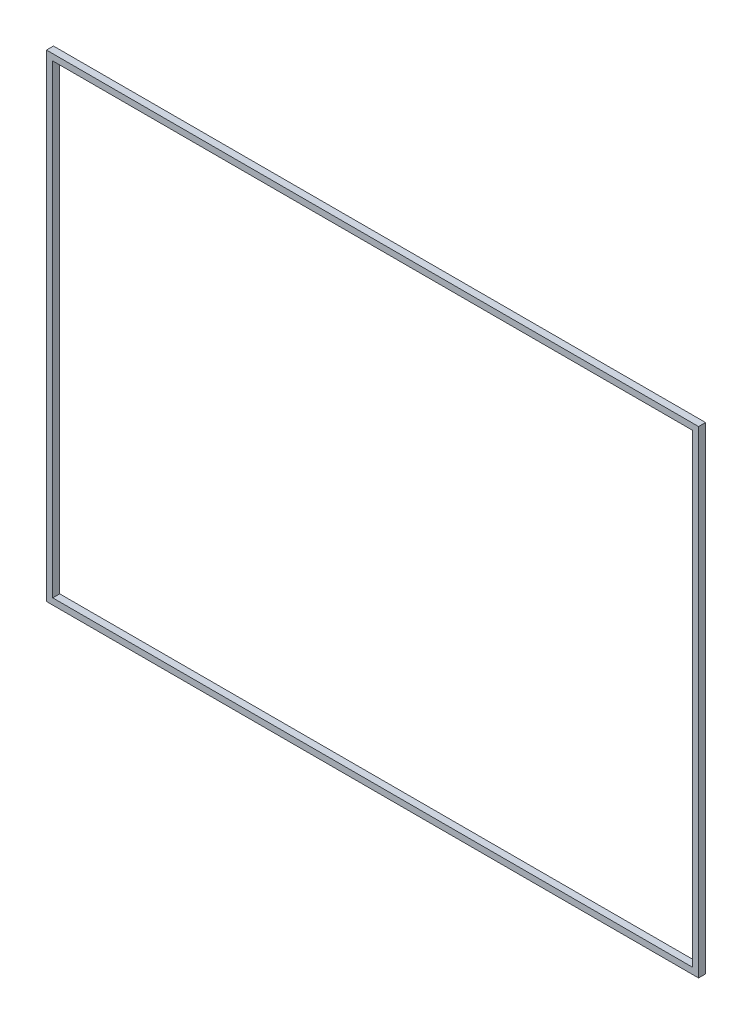
ISO-10303-21;
HEADER;
FILE_DESCRIPTION(('STEP AP214'),'2;1');
FILE_NAME('part.step','',(''),(''),'','','');
FILE_SCHEMA(('AUTOMOTIVE_DESIGN { 1 0 10303 214 1 1 1 1 }'));
ENDSEC;
DATA;
#1=APPLICATION_CONTEXT('core data for automotive mechanical design processes');
#2=APPLICATION_PROTOCOL_DEFINITION('international standard','automotive_design',2000,#1);
#3=PRODUCT_CONTEXT('',#1,'mechanical');
#4=PRODUCT('Part','Part','',(#3));
#5=PRODUCT_RELATED_PRODUCT_CATEGORY('part','',(#4));
#6=PRODUCT_DEFINITION_FORMATION('','',#4);
#7=PRODUCT_DEFINITION_CONTEXT('part definition',#1,'design');
#8=PRODUCT_DEFINITION('design','',#6,#7);
#9=PRODUCT_DEFINITION_SHAPE('','',#8);
#10=(LENGTH_UNIT() NAMED_UNIT(*) SI_UNIT(.MILLI.,.METRE.));
#11=(NAMED_UNIT(*) PLANE_ANGLE_UNIT() SI_UNIT($,.RADIAN.));
#12=(NAMED_UNIT(*) SI_UNIT($,.STERADIAN.) SOLID_ANGLE_UNIT());
#13=UNCERTAINTY_MEASURE_WITH_UNIT(LENGTH_MEASURE(1.E-05),#10,'distance_accuracy_value','');
#14=(GEOMETRIC_REPRESENTATION_CONTEXT(3) GLOBAL_UNCERTAINTY_ASSIGNED_CONTEXT((#13)) GLOBAL_UNIT_ASSIGNED_CONTEXT((#10,
#11,#12)) REPRESENTATION_CONTEXT('',''));
#15=CARTESIAN_POINT('',(0.,0.,0.));
#16=DIRECTION('',(0.,0.,1.));
#17=DIRECTION('',(1.,0.,0.));
#18=AXIS2_PLACEMENT_3D('',#15,#16,#17);
#19=CARTESIAN_POINT('',(0.,0.,44.5));
#20=DIRECTION('',(0.,0.,1.));
#21=DIRECTION('',(1.,0.,0.));
#22=AXIS2_PLACEMENT_3D('',#19,#20,#21);
#23=PLANE('',#22);
#24=DIRECTION('',(0.,-1.,0.));
#25=VECTOR('',#24,1.);
#26=CARTESIAN_POINT('',(-93.4,68.4,44.5));
#27=LINE('',#26,#25);
#28=CARTESIAN_POINT('',(-93.4,68.4,44.5));
#29=VERTEX_POINT('',#28);
#30=CARTESIAN_POINT('',(-93.4,-68.4,44.5));
#31=VERTEX_POINT('',#30);
#32=EDGE_CURVE('E157',#29,#31,#27,.T.);
#33=ORIENTED_EDGE('',*,*,#32,.T.);
#34=DIRECTION('',(1.,0.,0.));
#35=VECTOR('',#34,1.);
#36=CARTESIAN_POINT('',(-93.4,-68.4,44.5));
#37=LINE('',#36,#35);
#38=CARTESIAN_POINT('',(93.4,-68.4,44.5));
#39=VERTEX_POINT('',#38);
#40=EDGE_CURVE('E162',#31,#39,#37,.T.);
#41=ORIENTED_EDGE('',*,*,#40,.T.);
#42=DIRECTION('',(0.,1.,0.));
#43=VECTOR('',#42,1.);
#44=CARTESIAN_POINT('',(93.4,-68.4,44.5));
#45=LINE('',#44,#43);
#46=CARTESIAN_POINT('',(93.4,68.4,44.5));
#47=VERTEX_POINT('',#46);
#48=EDGE_CURVE('E170',#39,#47,#45,.T.);
#49=ORIENTED_EDGE('',*,*,#48,.T.);
#50=DIRECTION('',(-1.,0.,0.));
#51=VECTOR('',#50,1.);
#52=CARTESIAN_POINT('',(93.4,68.4,44.5));
#53=LINE('',#52,#51);
#54=EDGE_CURVE('E168',#47,#29,#53,.T.);
#55=ORIENTED_EDGE('',*,*,#54,.T.);
#56=EDGE_LOOP('',(#33,#41,#49,#55));
#57=FACE_BOUND('',#56,.T.);
#58=DIRECTION('',(1.,0.,0.));
#59=VECTOR('',#58,1.);
#60=CARTESIAN_POINT('',(-91.6,-66.6,44.5));
#61=LINE('',#60,#59);
#62=CARTESIAN_POINT('',(-91.6,-66.6,44.5));
#63=VERTEX_POINT('',#62);
#64=CARTESIAN_POINT('',(91.6,-66.6,44.5));
#65=VERTEX_POINT('',#64);
#66=EDGE_CURVE('E117',#63,#65,#61,.T.);
#67=ORIENTED_EDGE('',*,*,#66,.F.);
#68=DIRECTION('',(0.,-1.,0.));
#69=VECTOR('',#68,1.);
#70=CARTESIAN_POINT('',(-91.6,66.6,44.5));
#71=LINE('',#70,#69);
#72=CARTESIAN_POINT('',(-91.6,66.6,44.5));
#73=VERTEX_POINT('',#72);
#74=EDGE_CURVE('E112',#73,#63,#71,.T.);
#75=ORIENTED_EDGE('',*,*,#74,.F.);
#76=DIRECTION('',(-1.,0.,0.));
#77=VECTOR('',#76,1.);
#78=CARTESIAN_POINT('',(91.6,66.6,44.5));
#79=LINE('',#78,#77);
#80=CARTESIAN_POINT('',(91.6,66.6,44.5));
#81=VERTEX_POINT('',#80);
#82=EDGE_CURVE('E140',#81,#73,#79,.T.);
#83=ORIENTED_EDGE('',*,*,#82,.F.);
#84=DIRECTION('',(0.,1.,0.));
#85=VECTOR('',#84,1.);
#86=CARTESIAN_POINT('',(91.6,-66.6,44.5));
#87=LINE('',#86,#85);
#88=EDGE_CURVE('E135',#65,#81,#87,.T.);
#89=ORIENTED_EDGE('',*,*,#88,.F.);
#90=EDGE_LOOP('',(#67,#75,#83,#89));
#91=FACE_BOUND('',#90,.T.);
#92=ADVANCED_FACE('F44',(#57,#91),#23,.T.);
#93=CARTESIAN_POINT('',(0.,0.,42.5));
#94=DIRECTION('',(0.,0.,1.));
#95=DIRECTION('',(1.,0.,0.));
#96=AXIS2_PLACEMENT_3D('',#93,#94,#95);
#97=PLANE('',#96);
#98=DIRECTION('',(0.,-1.,0.));
#99=VECTOR('',#98,1.);
#100=CARTESIAN_POINT('',(-93.4,68.4,42.5));
#101=LINE('',#100,#99);
#102=CARTESIAN_POINT('',(-93.4,68.4,42.5));
#103=VERTEX_POINT('',#102);
#104=CARTESIAN_POINT('',(-93.4,-68.4,42.5));
#105=VERTEX_POINT('',#104);
#106=EDGE_CURVE('E129',#103,#105,#101,.T.);
#107=ORIENTED_EDGE('',*,*,#106,.F.);
#108=DIRECTION('',(-1.,0.,0.));
#109=VECTOR('',#108,1.);
#110=CARTESIAN_POINT('',(93.4,68.4,42.5));
#111=LINE('',#110,#109);
#112=CARTESIAN_POINT('',(93.4,68.4,42.5));
#113=VERTEX_POINT('',#112);
#114=EDGE_CURVE('E163',#113,#103,#111,.T.);
#115=ORIENTED_EDGE('',*,*,#114,.F.);
#116=DIRECTION('',(0.,1.,0.));
#117=VECTOR('',#116,1.);
#118=CARTESIAN_POINT('',(93.4,-68.4,42.5));
#119=LINE('',#118,#117);
#120=CARTESIAN_POINT('',(93.4,-68.4,42.5));
#121=VERTEX_POINT('',#120);
#122=EDGE_CURVE('E179',#121,#113,#119,.T.);
#123=ORIENTED_EDGE('',*,*,#122,.F.);
#124=DIRECTION('',(1.,0.,0.));
#125=VECTOR('',#124,1.);
#126=CARTESIAN_POINT('',(-93.4,-68.4,42.5));
#127=LINE('',#126,#125);
#128=EDGE_CURVE('E180',#105,#121,#127,.T.);
#129=ORIENTED_EDGE('',*,*,#128,.F.);
#130=EDGE_LOOP('',(#107,#115,#123,#129));
#131=FACE_BOUND('',#130,.T.);
#132=DIRECTION('',(0.,-1.,0.));
#133=VECTOR('',#132,1.);
#134=CARTESIAN_POINT('',(-91.6,66.6,42.5));
#135=LINE('',#134,#133);
#136=CARTESIAN_POINT('',(-91.6,66.6,42.5));
#137=VERTEX_POINT('',#136);
#138=CARTESIAN_POINT('',(-91.6,-66.6,42.5));
#139=VERTEX_POINT('',#138);
#140=EDGE_CURVE('E68',#137,#139,#135,.T.);
#141=ORIENTED_EDGE('',*,*,#140,.T.);
#142=DIRECTION('',(1.,0.,0.));
#143=VECTOR('',#142,1.);
#144=CARTESIAN_POINT('',(-91.6,-66.6,42.5));
#145=LINE('',#144,#143);
#146=CARTESIAN_POINT('',(91.6,-66.6,42.5));
#147=VERTEX_POINT('',#146);
#148=EDGE_CURVE('E130',#139,#147,#145,.T.);
#149=ORIENTED_EDGE('',*,*,#148,.T.);
#150=DIRECTION('',(0.,1.,0.));
#151=VECTOR('',#150,1.);
#152=CARTESIAN_POINT('',(91.6,-66.6,42.5));
#153=LINE('',#152,#151);
#154=CARTESIAN_POINT('',(91.6,66.6,42.5));
#155=VERTEX_POINT('',#154);
#156=EDGE_CURVE('E148',#147,#155,#153,.T.);
#157=ORIENTED_EDGE('',*,*,#156,.T.);
#158=DIRECTION('',(-1.,0.,0.));
#159=VECTOR('',#158,1.);
#160=CARTESIAN_POINT('',(91.6,66.6,42.5));
#161=LINE('',#160,#159);
#162=EDGE_CURVE('E121',#155,#137,#161,.T.);
#163=ORIENTED_EDGE('',*,*,#162,.T.);
#164=EDGE_LOOP('',(#141,#149,#157,#163));
#165=FACE_BOUND('',#164,.T.);
#166=ADVANCED_FACE('F201',(#131,#165),#97,.F.);
#167=CARTESIAN_POINT('',(-93.4,68.4,44.5));
#168=DIRECTION('',(1.,0.,0.));
#169=DIRECTION('',(0.,0.,-1.));
#170=AXIS2_PLACEMENT_3D('',#167,#168,#169);
#171=PLANE('',#170);
#172=ORIENTED_EDGE('',*,*,#106,.T.);
#173=DIRECTION('',(0.,0.,-1.));
#174=VECTOR('',#173,1.);
#175=CARTESIAN_POINT('',(-93.4,-68.4,44.5));
#176=LINE('',#175,#174);
#177=EDGE_CURVE('E11',#31,#105,#176,.T.);
#178=ORIENTED_EDGE('',*,*,#177,.F.);
#179=ORIENTED_EDGE('',*,*,#32,.F.);
#180=DIRECTION('',(0.,0.,-1.));
#181=VECTOR('',#180,1.);
#182=CARTESIAN_POINT('',(-93.4,68.4,44.5));
#183=LINE('',#182,#181);
#184=EDGE_CURVE('E175',#29,#103,#183,.T.);
#185=ORIENTED_EDGE('',*,*,#184,.T.);
#186=EDGE_LOOP('',(#172,#178,#179,#185));
#187=FACE_BOUND('',#186,.T.);
#188=ADVANCED_FACE('F50',(#187),#171,.F.);
#189=CARTESIAN_POINT('',(-93.4,-68.4,44.5));
#190=DIRECTION('',(0.,1.,0.));
#191=DIRECTION('',(0.,0.,1.));
#192=AXIS2_PLACEMENT_3D('',#189,#190,#191);
#193=PLANE('',#192);
#194=ORIENTED_EDGE('',*,*,#128,.T.);
#195=DIRECTION('',(0.,0.,-1.));
#196=VECTOR('',#195,1.);
#197=CARTESIAN_POINT('',(93.4,-68.4,44.5));
#198=LINE('',#197,#196);
#199=EDGE_CURVE('E53',#39,#121,#198,.T.);
#200=ORIENTED_EDGE('',*,*,#199,.F.);
#201=ORIENTED_EDGE('',*,*,#40,.F.);
#202=ORIENTED_EDGE('',*,*,#177,.T.);
#203=EDGE_LOOP('',(#194,#200,#201,#202));
#204=FACE_BOUND('',#203,.T.);
#205=ADVANCED_FACE('F213',(#204),#193,.F.);
#206=CARTESIAN_POINT('',(93.4,-68.4,44.5));
#207=DIRECTION('',(-1.,0.,0.));
#208=DIRECTION('',(0.,0.,1.));
#209=AXIS2_PLACEMENT_3D('',#206,#207,#208);
#210=PLANE('',#209);
#211=ORIENTED_EDGE('',*,*,#122,.T.);
#212=DIRECTION('',(0.,0.,-1.));
#213=VECTOR('',#212,1.);
#214=CARTESIAN_POINT('',(93.4,68.4,44.5));
#215=LINE('',#214,#213);
#216=EDGE_CURVE('E190',#47,#113,#215,.T.);
#217=ORIENTED_EDGE('',*,*,#216,.F.);
#218=ORIENTED_EDGE('',*,*,#48,.F.);
#219=ORIENTED_EDGE('',*,*,#199,.T.);
#220=EDGE_LOOP('',(#211,#217,#218,#219));
#221=FACE_BOUND('',#220,.T.);
#222=ADVANCED_FACE('F197',(#221),#210,.F.);
#223=CARTESIAN_POINT('',(93.4,68.4,44.5));
#224=DIRECTION('',(0.,-1.,0.));
#225=DIRECTION('',(0.,0.,-1.));
#226=AXIS2_PLACEMENT_3D('',#223,#224,#225);
#227=PLANE('',#226);
#228=ORIENTED_EDGE('',*,*,#114,.T.);
#229=ORIENTED_EDGE('',*,*,#184,.F.);
#230=ORIENTED_EDGE('',*,*,#54,.F.);
#231=ORIENTED_EDGE('',*,*,#216,.T.);
#232=EDGE_LOOP('',(#228,#229,#230,#231));
#233=FACE_BOUND('',#232,.T.);
#234=ADVANCED_FACE('F210',(#233),#227,.F.);
#235=CARTESIAN_POINT('',(-91.6,66.6,44.5));
#236=DIRECTION('',(1.,0.,0.));
#237=DIRECTION('',(0.,0.,-1.));
#238=AXIS2_PLACEMENT_3D('',#235,#236,#237);
#239=PLANE('',#238);
#240=ORIENTED_EDGE('',*,*,#140,.F.);
#241=DIRECTION('',(0.,0.,-1.));
#242=VECTOR('',#241,1.);
#243=CARTESIAN_POINT('',(-91.6,66.6,44.5));
#244=LINE('',#243,#242);
#245=EDGE_CURVE('E113',#73,#137,#244,.T.);
#246=ORIENTED_EDGE('',*,*,#245,.F.);
#247=ORIENTED_EDGE('',*,*,#74,.T.);
#248=DIRECTION('',(0.,0.,-1.));
#249=VECTOR('',#248,1.);
#250=CARTESIAN_POINT('',(-91.6,-66.6,44.5));
#251=LINE('',#250,#249);
#252=EDGE_CURVE('E111',#63,#139,#251,.T.);
#253=ORIENTED_EDGE('',*,*,#252,.T.);
#254=EDGE_LOOP('',(#240,#246,#247,#253));
#255=FACE_BOUND('',#254,.T.);
#256=ADVANCED_FACE('F114',(#255),#239,.T.);
#257=CARTESIAN_POINT('',(-91.6,-66.6,44.5));
#258=DIRECTION('',(0.,1.,0.));
#259=DIRECTION('',(0.,0.,1.));
#260=AXIS2_PLACEMENT_3D('',#257,#258,#259);
#261=PLANE('',#260);
#262=ORIENTED_EDGE('',*,*,#148,.F.);
#263=ORIENTED_EDGE('',*,*,#252,.F.);
#264=ORIENTED_EDGE('',*,*,#66,.T.);
#265=DIRECTION('',(0.,0.,-1.));
#266=VECTOR('',#265,1.);
#267=CARTESIAN_POINT('',(91.6,-66.6,44.5));
#268=LINE('',#267,#266);
#269=EDGE_CURVE('E128',#65,#147,#268,.T.);
#270=ORIENTED_EDGE('',*,*,#269,.T.);
#271=EDGE_LOOP('',(#262,#263,#264,#270));
#272=FACE_BOUND('',#271,.T.);
#273=ADVANCED_FACE('F123',(#272),#261,.T.);
#274=CARTESIAN_POINT('',(91.6,-66.6,44.5));
#275=DIRECTION('',(-1.,0.,0.));
#276=DIRECTION('',(0.,0.,1.));
#277=AXIS2_PLACEMENT_3D('',#274,#275,#276);
#278=PLANE('',#277);
#279=ORIENTED_EDGE('',*,*,#156,.F.);
#280=ORIENTED_EDGE('',*,*,#269,.F.);
#281=ORIENTED_EDGE('',*,*,#88,.T.);
#282=DIRECTION('',(0.,0.,-1.));
#283=VECTOR('',#282,1.);
#284=CARTESIAN_POINT('',(91.6,66.6,44.5));
#285=LINE('',#284,#283);
#286=EDGE_CURVE('E64',#81,#155,#285,.T.);
#287=ORIENTED_EDGE('',*,*,#286,.T.);
#288=EDGE_LOOP('',(#279,#280,#281,#287));
#289=FACE_BOUND('',#288,.T.);
#290=ADVANCED_FACE('F237',(#289),#278,.T.);
#291=CARTESIAN_POINT('',(91.6,66.6,44.5));
#292=DIRECTION('',(0.,-1.,0.));
#293=DIRECTION('',(0.,0.,-1.));
#294=AXIS2_PLACEMENT_3D('',#291,#292,#293);
#295=PLANE('',#294);
#296=ORIENTED_EDGE('',*,*,#162,.F.);
#297=ORIENTED_EDGE('',*,*,#286,.F.);
#298=ORIENTED_EDGE('',*,*,#82,.T.);
#299=ORIENTED_EDGE('',*,*,#245,.T.);
#300=EDGE_LOOP('',(#296,#297,#298,#299));
#301=FACE_BOUND('',#300,.T.);
#302=ADVANCED_FACE('F238',(#301),#295,.T.);
#303=CLOSED_SHELL('',(#92,#166,#188,#205,#222,#234,#256,#273,#290,#302));
#304=MANIFOLD_SOLID_BREP('B2',#303);
#305=ADVANCED_BREP_SHAPE_REPRESENTATION('',(#18,#304),#14);
#306=SHAPE_DEFINITION_REPRESENTATION(#9,#305);
ENDSEC;
END-ISO-10303-21;
